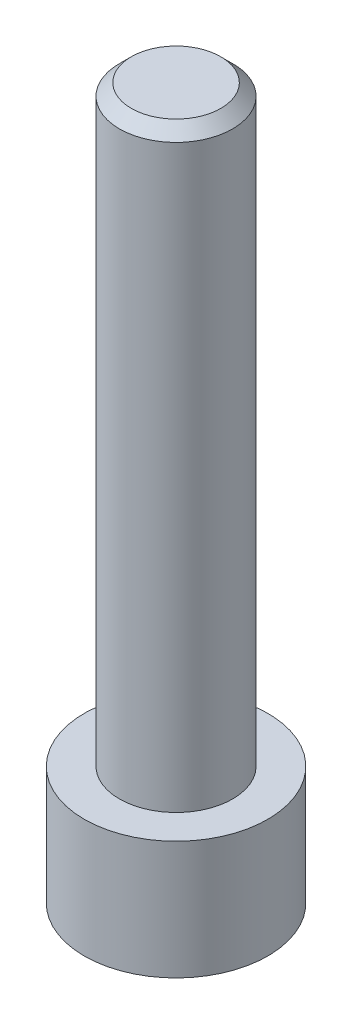
ISO-10303-21;
HEADER;
FILE_DESCRIPTION(('STEP AP214'),'2;1');
FILE_NAME('part.step','',(''),(''),'','','');
FILE_SCHEMA(('AUTOMOTIVE_DESIGN { 1 0 10303 214 1 1 1 1 }'));
ENDSEC;
DATA;
#1=APPLICATION_CONTEXT('core data for automotive mechanical design processes');
#2=APPLICATION_PROTOCOL_DEFINITION('international standard','automotive_design',2000,#1);
#3=PRODUCT_CONTEXT('',#1,'mechanical');
#4=PRODUCT('Part','Part','',(#3));
#5=PRODUCT_RELATED_PRODUCT_CATEGORY('part','',(#4));
#6=PRODUCT_DEFINITION_FORMATION('','',#4);
#7=PRODUCT_DEFINITION_CONTEXT('part definition',#1,'design');
#8=PRODUCT_DEFINITION('design','',#6,#7);
#9=PRODUCT_DEFINITION_SHAPE('','',#8);
#10=(LENGTH_UNIT() NAMED_UNIT(*) SI_UNIT(.MILLI.,.METRE.));
#11=(NAMED_UNIT(*) PLANE_ANGLE_UNIT() SI_UNIT($,.RADIAN.));
#12=(NAMED_UNIT(*) SI_UNIT($,.STERADIAN.) SOLID_ANGLE_UNIT());
#13=UNCERTAINTY_MEASURE_WITH_UNIT(LENGTH_MEASURE(1.E-05),#10,'distance_accuracy_value','');
#14=(GEOMETRIC_REPRESENTATION_CONTEXT(3) GLOBAL_UNCERTAINTY_ASSIGNED_CONTEXT((#13)) GLOBAL_UNIT_ASSIGNED_CONTEXT((#10,
#11,#12)) REPRESENTATION_CONTEXT('',''));
#15=CARTESIAN_POINT('',(0.,0.,0.));
#16=DIRECTION('',(0.,0.,1.));
#17=DIRECTION('',(1.,0.,0.));
#18=AXIS2_PLACEMENT_3D('',#15,#16,#17);
#19=CARTESIAN_POINT('',(0.,30.,0.));
#20=DIRECTION('',(0.,-1.,0.));
#21=DIRECTION('',(0.,0.,-1.));
#22=AXIS2_PLACEMENT_3D('',#19,#20,#21);
#23=CYLINDRICAL_SURFACE('',#22,3.875);
#24=CARTESIAN_POINT('',(0.,0.,0.));
#25=DIRECTION('',(0.,1.,0.));
#26=DIRECTION('',(0.,0.,1.));
#27=AXIS2_PLACEMENT_3D('',#24,#25,#26);
#28=CIRCLE('',#27,3.875);
#29=CARTESIAN_POINT('',(0.,0.,3.875));
#30=VERTEX_POINT('',#29);
#31=EDGE_CURVE('E145',#30,#30,#28,.T.);
#32=ORIENTED_EDGE('',*,*,#31,.T.);
#33=EDGE_LOOP('',(#32));
#34=FACE_BOUND('',#33,.T.);
#35=CARTESIAN_POINT('',(0.,5.,0.));
#36=DIRECTION('',(0.,1.,0.));
#37=DIRECTION('',(0.,0.,1.));
#38=AXIS2_PLACEMENT_3D('',#35,#36,#37);
#39=CIRCLE('',#38,3.875);
#40=CARTESIAN_POINT('',(0.,5.,3.875));
#41=VERTEX_POINT('',#40);
#42=EDGE_CURVE('E144',#41,#41,#39,.T.);
#43=ORIENTED_EDGE('',*,*,#42,.F.);
#44=EDGE_LOOP('',(#43));
#45=FACE_BOUND('',#44,.T.);
#46=ADVANCED_FACE('F34',(#34,#45),#23,.T.);
#47=CARTESIAN_POINT('',(0.,0.,0.));
#48=DIRECTION('',(0.,1.,0.));
#49=DIRECTION('',(0.,0.,1.));
#50=AXIS2_PLACEMENT_3D('',#47,#48,#49);
#51=PLANE('',#50);
#52=DIRECTION('',(-0.5,0.,0.866025403784439));
#53=VECTOR('',#52,1.);
#54=CARTESIAN_POINT('',(2.64426423288849,0.,0.));
#55=LINE('',#54,#53);
#56=CARTESIAN_POINT('',(2.64426423288849,0.,0.));
#57=VERTEX_POINT('',#56);
#58=CARTESIAN_POINT('',(1.32213211644424,0.,2.29));
#59=VERTEX_POINT('',#58);
#60=EDGE_CURVE('E123',#57,#59,#55,.T.);
#61=ORIENTED_EDGE('',*,*,#60,.F.);
#62=DIRECTION('',(0.5,0.,0.866025403784439));
#63=VECTOR('',#62,1.);
#64=CARTESIAN_POINT('',(1.32213211644424,0.,-2.29));
#65=LINE('',#64,#63);
#66=CARTESIAN_POINT('',(1.32213211644424,0.,-2.29));
#67=VERTEX_POINT('',#66);
#68=EDGE_CURVE('E49',#67,#57,#65,.T.);
#69=ORIENTED_EDGE('',*,*,#68,.F.);
#70=DIRECTION('',(1.,0.,0.));
#71=VECTOR('',#70,1.);
#72=CARTESIAN_POINT('',(-1.32213211644424,0.,-2.29));
#73=LINE('',#72,#71);
#74=CARTESIAN_POINT('',(-1.32213211644424,0.,-2.29));
#75=VERTEX_POINT('',#74);
#76=EDGE_CURVE('E132',#75,#67,#73,.T.);
#77=ORIENTED_EDGE('',*,*,#76,.F.);
#78=DIRECTION('',(0.5,0.,-0.866025403784439));
#79=VECTOR('',#78,1.);
#80=CARTESIAN_POINT('',(-2.64426423288849,0.,0.));
#81=LINE('',#80,#79);
#82=CARTESIAN_POINT('',(-2.64426423288849,0.,0.));
#83=VERTEX_POINT('',#82);
#84=EDGE_CURVE('E130',#83,#75,#81,.T.);
#85=ORIENTED_EDGE('',*,*,#84,.F.);
#86=DIRECTION('',(-0.5,0.,-0.866025403784439));
#87=VECTOR('',#86,1.);
#88=CARTESIAN_POINT('',(-1.32213211644424,0.,2.29));
#89=LINE('',#88,#87);
#90=CARTESIAN_POINT('',(-1.32213211644424,0.,2.29));
#91=VERTEX_POINT('',#90);
#92=EDGE_CURVE('E97',#91,#83,#89,.T.);
#93=ORIENTED_EDGE('',*,*,#92,.F.);
#94=DIRECTION('',(-1.,0.,0.));
#95=VECTOR('',#94,1.);
#96=CARTESIAN_POINT('',(1.32213211644424,0.,2.29));
#97=LINE('',#96,#95);
#98=EDGE_CURVE('E126',#59,#91,#97,.T.);
#99=ORIENTED_EDGE('',*,*,#98,.F.);
#100=EDGE_LOOP('',(#61,#69,#77,#85,#93,#99));
#101=FACE_BOUND('',#100,.T.);
#102=ORIENTED_EDGE('',*,*,#31,.F.);
#103=EDGE_LOOP('',(#102));
#104=FACE_BOUND('',#103,.T.);
#105=ADVANCED_FACE('F167',(#101,#104),#51,.F.);
#106=CARTESIAN_POINT('',(0.,5.,0.));
#107=DIRECTION('',(0.,1.,0.));
#108=DIRECTION('',(0.,0.,1.));
#109=AXIS2_PLACEMENT_3D('',#106,#107,#108);
#110=PLANE('',#109);
#111=CARTESIAN_POINT('',(0.,5.,0.));
#112=DIRECTION('',(0.,1.,0.));
#113=DIRECTION('',(0.,0.,1.));
#114=AXIS2_PLACEMENT_3D('',#111,#112,#113);
#115=CIRCLE('',#114,2.39);
#116=CARTESIAN_POINT('',(0.,5.,2.39));
#117=VERTEX_POINT('',#116);
#118=EDGE_CURVE('E136',#117,#117,#115,.T.);
#119=ORIENTED_EDGE('',*,*,#118,.F.);
#120=EDGE_LOOP('',(#119));
#121=FACE_BOUND('',#120,.T.);
#122=ORIENTED_EDGE('',*,*,#42,.T.);
#123=EDGE_LOOP('',(#122));
#124=FACE_BOUND('',#123,.T.);
#125=ADVANCED_FACE('F172',(#121,#124),#110,.T.);
#126=CARTESIAN_POINT('',(0.,5.,0.));
#127=DIRECTION('',(0.,1.,0.));
#128=DIRECTION('',(0.,0.,1.));
#129=AXIS2_PLACEMENT_3D('',#126,#127,#128);
#130=CYLINDRICAL_SURFACE('',#129,2.39);
#131=CARTESIAN_POINT('',(0.,29.5,0.));
#132=DIRECTION('',(0.,1.,0.));
#133=DIRECTION('',(0.,0.,1.));
#134=AXIS2_PLACEMENT_3D('',#131,#132,#133);
#135=CIRCLE('',#134,2.39);
#136=CARTESIAN_POINT('',(0.,29.5,2.39));
#137=VERTEX_POINT('',#136);
#138=EDGE_CURVE('E12',#137,#137,#135,.F.);
#139=ORIENTED_EDGE('',*,*,#138,.T.);
#140=EDGE_LOOP('',(#139));
#141=FACE_BOUND('',#140,.T.);
#142=ORIENTED_EDGE('',*,*,#118,.T.);
#143=EDGE_LOOP('',(#142));
#144=FACE_BOUND('',#143,.T.);
#145=ADVANCED_FACE('F163',(#141,#144),#130,.T.);
#146=CARTESIAN_POINT('',(0.,30.,0.));
#147=DIRECTION('',(0.,1.,0.));
#148=DIRECTION('',(0.,0.,1.));
#149=AXIS2_PLACEMENT_3D('',#146,#147,#148);
#150=PLANE('',#149);
#151=CARTESIAN_POINT('',(0.,30.,0.));
#152=DIRECTION('',(0.,1.,0.));
#153=DIRECTION('',(0.,0.,1.));
#154=AXIS2_PLACEMENT_3D('',#151,#152,#153);
#155=CIRCLE('',#154,1.89);
#156=CARTESIAN_POINT('',(0.,30.,1.89));
#157=VERTEX_POINT('',#156);
#158=EDGE_CURVE('E42',#157,#157,#155,.T.);
#159=ORIENTED_EDGE('',*,*,#158,.T.);
#160=EDGE_LOOP('',(#159));
#161=FACE_BOUND('',#160,.T.);
#162=ADVANCED_FACE('F152',(#161),#150,.T.);
#163=CARTESIAN_POINT('',(0.,30.,0.));
#164=DIRECTION('',(0.,-1.,0.));
#165=DIRECTION('',(0.,0.,-1.));
#166=AXIS2_PLACEMENT_3D('',#163,#164,#165);
#167=CONICAL_SURFACE('',#166,1.89,0.785398163397445);
#168=ORIENTED_EDGE('',*,*,#138,.F.);
#169=EDGE_LOOP('',(#168));
#170=FACE_BOUND('',#169,.T.);
#171=ORIENTED_EDGE('',*,*,#158,.F.);
#172=EDGE_LOOP('',(#171));
#173=FACE_BOUND('',#172,.T.);
#174=ADVANCED_FACE('F36',(#170,#173),#167,.T.);
#175=CARTESIAN_POINT('',(1.32213211644424,3.36,-2.29));
#176=DIRECTION('',(0.866025403784439,0.,-0.5));
#177=DIRECTION('',(-0.5,0.,-0.866025403784439));
#178=AXIS2_PLACEMENT_3D('',#175,#176,#177);
#179=PLANE('',#178);
#180=ORIENTED_EDGE('',*,*,#68,.T.);
#181=DIRECTION('',(0.,-1.,0.));
#182=VECTOR('',#181,1.);
#183=CARTESIAN_POINT('',(2.64426423288849,3.36,0.));
#184=LINE('',#183,#182);
#185=CARTESIAN_POINT('',(2.64426423288849,3.36,0.));
#186=VERTEX_POINT('',#185);
#187=EDGE_CURVE('E79',#186,#57,#184,.T.);
#188=ORIENTED_EDGE('',*,*,#187,.F.);
#189=DIRECTION('',(0.5,0.,0.866025403784439));
#190=VECTOR('',#189,1.);
#191=CARTESIAN_POINT('',(1.32213211644424,3.36,-2.29));
#192=LINE('',#191,#190);
#193=CARTESIAN_POINT('',(1.32213211644424,3.36,-2.29));
#194=VERTEX_POINT('',#193);
#195=EDGE_CURVE('E134',#194,#186,#192,.T.);
#196=ORIENTED_EDGE('',*,*,#195,.F.);
#197=DIRECTION('',(0.,-1.,0.));
#198=VECTOR('',#197,1.);
#199=CARTESIAN_POINT('',(1.32213211644424,3.36,-2.29));
#200=LINE('',#199,#198);
#201=EDGE_CURVE('E57',#194,#67,#200,.T.);
#202=ORIENTED_EDGE('',*,*,#201,.T.);
#203=EDGE_LOOP('',(#180,#188,#196,#202));
#204=FACE_BOUND('',#203,.T.);
#205=ADVANCED_FACE('F155',(#204),#179,.F.);
#206=CARTESIAN_POINT('',(-1.32213211644424,3.36,-2.29));
#207=DIRECTION('',(0.,0.,-1.));
#208=DIRECTION('',(-1.,0.,0.));
#209=AXIS2_PLACEMENT_3D('',#206,#207,#208);
#210=PLANE('',#209);
#211=ORIENTED_EDGE('',*,*,#76,.T.);
#212=ORIENTED_EDGE('',*,*,#201,.F.);
#213=DIRECTION('',(1.,0.,0.));
#214=VECTOR('',#213,1.);
#215=CARTESIAN_POINT('',(-1.32213211644424,3.36,-2.29));
#216=LINE('',#215,#214);
#217=CARTESIAN_POINT('',(-1.32213211644424,3.36,-2.29));
#218=VERTEX_POINT('',#217);
#219=EDGE_CURVE('E109',#218,#194,#216,.T.);
#220=ORIENTED_EDGE('',*,*,#219,.F.);
#221=DIRECTION('',(0.,-1.,0.));
#222=VECTOR('',#221,1.);
#223=CARTESIAN_POINT('',(-1.32213211644424,3.36,-2.29));
#224=LINE('',#223,#222);
#225=EDGE_CURVE('E101',#218,#75,#224,.T.);
#226=ORIENTED_EDGE('',*,*,#225,.T.);
#227=EDGE_LOOP('',(#211,#212,#220,#226));
#228=FACE_BOUND('',#227,.T.);
#229=ADVANCED_FACE('F161',(#228),#210,.F.);
#230=CARTESIAN_POINT('',(-2.64426423288849,3.36,0.));
#231=DIRECTION('',(-0.866025403784438,0.,-0.5));
#232=DIRECTION('',(-0.5,0.,0.866025403784439));
#233=AXIS2_PLACEMENT_3D('',#230,#231,#232);
#234=PLANE('',#233);
#235=ORIENTED_EDGE('',*,*,#84,.T.);
#236=ORIENTED_EDGE('',*,*,#225,.F.);
#237=DIRECTION('',(0.5,0.,-0.866025403784439));
#238=VECTOR('',#237,1.);
#239=CARTESIAN_POINT('',(-2.64426423288849,3.36,0.));
#240=LINE('',#239,#238);
#241=CARTESIAN_POINT('',(-2.64426423288849,3.36,0.));
#242=VERTEX_POINT('',#241);
#243=EDGE_CURVE('E105',#242,#218,#240,.T.);
#244=ORIENTED_EDGE('',*,*,#243,.F.);
#245=DIRECTION('',(0.,-1.,0.));
#246=VECTOR('',#245,1.);
#247=CARTESIAN_POINT('',(-2.64426423288849,3.36,0.));
#248=LINE('',#247,#246);
#249=EDGE_CURVE('E90',#242,#83,#248,.T.);
#250=ORIENTED_EDGE('',*,*,#249,.T.);
#251=EDGE_LOOP('',(#235,#236,#244,#250));
#252=FACE_BOUND('',#251,.T.);
#253=ADVANCED_FACE('F106',(#252),#234,.F.);
#254=CARTESIAN_POINT('',(-1.32213211644424,3.36,2.29));
#255=DIRECTION('',(-0.866025403784439,0.,0.5));
#256=DIRECTION('',(0.5,0.,0.866025403784439));
#257=AXIS2_PLACEMENT_3D('',#254,#255,#256);
#258=PLANE('',#257);
#259=ORIENTED_EDGE('',*,*,#92,.T.);
#260=ORIENTED_EDGE('',*,*,#249,.F.);
#261=DIRECTION('',(-0.5,0.,-0.866025403784439));
#262=VECTOR('',#261,1.);
#263=CARTESIAN_POINT('',(-1.32213211644424,3.36,2.29));
#264=LINE('',#263,#262);
#265=CARTESIAN_POINT('',(-1.32213211644424,3.36,2.29));
#266=VERTEX_POINT('',#265);
#267=EDGE_CURVE('E94',#266,#242,#264,.T.);
#268=ORIENTED_EDGE('',*,*,#267,.F.);
#269=DIRECTION('',(0.,-1.,0.));
#270=VECTOR('',#269,1.);
#271=CARTESIAN_POINT('',(-1.32213211644424,3.36,2.29));
#272=LINE('',#271,#270);
#273=EDGE_CURVE('E102',#266,#91,#272,.T.);
#274=ORIENTED_EDGE('',*,*,#273,.T.);
#275=EDGE_LOOP('',(#259,#260,#268,#274));
#276=FACE_BOUND('',#275,.T.);
#277=ADVANCED_FACE('F92',(#276),#258,.F.);
#278=CARTESIAN_POINT('',(1.32213211644424,3.36,2.29));
#279=DIRECTION('',(0.,0.,1.));
#280=DIRECTION('',(1.,0.,0.));
#281=AXIS2_PLACEMENT_3D('',#278,#279,#280);
#282=PLANE('',#281);
#283=ORIENTED_EDGE('',*,*,#98,.T.);
#284=ORIENTED_EDGE('',*,*,#273,.F.);
#285=DIRECTION('',(-1.,0.,0.));
#286=VECTOR('',#285,1.);
#287=CARTESIAN_POINT('',(1.32213211644424,3.36,2.29));
#288=LINE('',#287,#286);
#289=CARTESIAN_POINT('',(1.32213211644424,3.36,2.29));
#290=VERTEX_POINT('',#289);
#291=EDGE_CURVE('E115',#290,#266,#288,.T.);
#292=ORIENTED_EDGE('',*,*,#291,.F.);
#293=DIRECTION('',(0.,-1.,0.));
#294=VECTOR('',#293,1.);
#295=CARTESIAN_POINT('',(1.32213211644424,3.36,2.29));
#296=LINE('',#295,#294);
#297=EDGE_CURVE('E139',#290,#59,#296,.T.);
#298=ORIENTED_EDGE('',*,*,#297,.T.);
#299=EDGE_LOOP('',(#283,#284,#292,#298));
#300=FACE_BOUND('',#299,.T.);
#301=ADVANCED_FACE('F186',(#300),#282,.F.);
#302=CARTESIAN_POINT('',(2.64426423288849,3.36,0.));
#303=DIRECTION('',(0.866025403784439,0.,0.5));
#304=DIRECTION('',(0.5,0.,-0.866025403784439));
#305=AXIS2_PLACEMENT_3D('',#302,#303,#304);
#306=PLANE('',#305);
#307=ORIENTED_EDGE('',*,*,#60,.T.);
#308=ORIENTED_EDGE('',*,*,#297,.F.);
#309=DIRECTION('',(-0.5,0.,0.866025403784439));
#310=VECTOR('',#309,1.);
#311=CARTESIAN_POINT('',(2.64426423288849,3.36,0.));
#312=LINE('',#311,#310);
#313=EDGE_CURVE('E117',#186,#290,#312,.T.);
#314=ORIENTED_EDGE('',*,*,#313,.F.);
#315=ORIENTED_EDGE('',*,*,#187,.T.);
#316=EDGE_LOOP('',(#307,#308,#314,#315));
#317=FACE_BOUND('',#316,.T.);
#318=ADVANCED_FACE('F183',(#317),#306,.F.);
#319=CARTESIAN_POINT('',(0.,3.36,0.));
#320=DIRECTION('',(0.,-1.,0.));
#321=DIRECTION('',(0.,0.,-1.));
#322=AXIS2_PLACEMENT_3D('',#319,#320,#321);
#323=PLANE('',#322);
#324=ORIENTED_EDGE('',*,*,#195,.T.);
#325=ORIENTED_EDGE('',*,*,#313,.T.);
#326=ORIENTED_EDGE('',*,*,#291,.T.);
#327=ORIENTED_EDGE('',*,*,#267,.T.);
#328=ORIENTED_EDGE('',*,*,#243,.T.);
#329=ORIENTED_EDGE('',*,*,#219,.T.);
#330=EDGE_LOOP('',(#324,#325,#326,#327,#328,#329));
#331=FACE_BOUND('',#330,.T.);
#332=ADVANCED_FACE('F112',(#331),#323,.T.);
#333=CLOSED_SHELL('',(#46,#105,#125,#145,#162,#174,#205,#229,#253,#277,#301,#318,#332));
#334=MANIFOLD_SOLID_BREP('B2',#333);
#335=ADVANCED_BREP_SHAPE_REPRESENTATION('',(#18,#334),#14);
#336=SHAPE_DEFINITION_REPRESENTATION(#9,#335);
ENDSEC;
END-ISO-10303-21;
